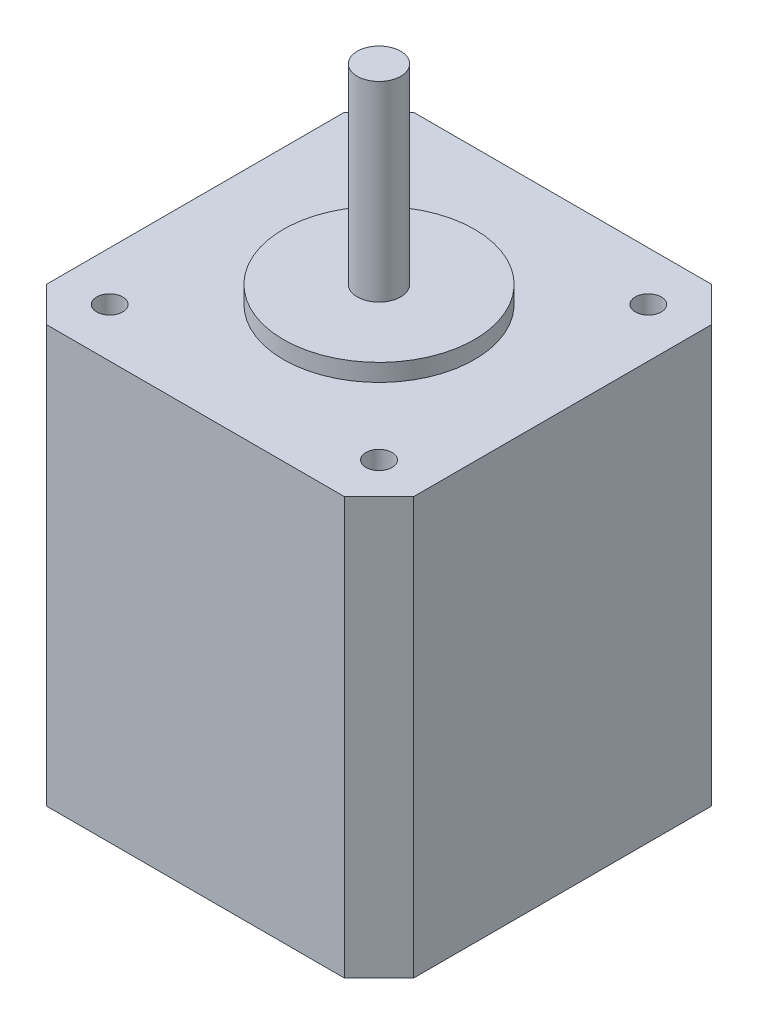
ISO-10303-21;
HEADER;
FILE_DESCRIPTION(('STEP AP214'),'2;1');
FILE_NAME('part.step','',(''),(''),'','','');
FILE_SCHEMA(('AUTOMOTIVE_DESIGN { 1 0 10303 214 1 1 1 1 }'));
ENDSEC;
DATA;
#1=APPLICATION_CONTEXT('core data for automotive mechanical design processes');
#2=APPLICATION_PROTOCOL_DEFINITION('international standard','automotive_design',2000,#1);
#3=PRODUCT_CONTEXT('',#1,'mechanical');
#4=PRODUCT('Part','Part','',(#3));
#5=PRODUCT_RELATED_PRODUCT_CATEGORY('part','',(#4));
#6=PRODUCT_DEFINITION_FORMATION('','',#4);
#7=PRODUCT_DEFINITION_CONTEXT('part definition',#1,'design');
#8=PRODUCT_DEFINITION('design','',#6,#7);
#9=PRODUCT_DEFINITION_SHAPE('','',#8);
#10=(LENGTH_UNIT() NAMED_UNIT(*) SI_UNIT(.MILLI.,.METRE.));
#11=(NAMED_UNIT(*) PLANE_ANGLE_UNIT() SI_UNIT($,.RADIAN.));
#12=(NAMED_UNIT(*) SI_UNIT($,.STERADIAN.) SOLID_ANGLE_UNIT());
#13=UNCERTAINTY_MEASURE_WITH_UNIT(LENGTH_MEASURE(1.E-05),#10,'distance_accuracy_value','');
#14=(GEOMETRIC_REPRESENTATION_CONTEXT(3) GLOBAL_UNCERTAINTY_ASSIGNED_CONTEXT((#13)) GLOBAL_UNIT_ASSIGNED_CONTEXT((#10,
#11,#12)) REPRESENTATION_CONTEXT('',''));
#15=CARTESIAN_POINT('',(0.,0.,0.));
#16=DIRECTION('',(0.,0.,1.));
#17=DIRECTION('',(1.,0.,0.));
#18=AXIS2_PLACEMENT_3D('',#15,#16,#17);
#19=CARTESIAN_POINT('',(0.,48.,0.));
#20=DIRECTION('',(0.,-1.,0.));
#21=DIRECTION('',(0.,0.,-1.));
#22=AXIS2_PLACEMENT_3D('',#19,#20,#21);
#23=PLANE('',#22);
#24=CARTESIAN_POINT('',(0.,48.,0.));
#25=DIRECTION('',(0.,1.,0.));
#26=DIRECTION('',(0.,0.,1.));
#27=AXIS2_PLACEMENT_3D('',#24,#25,#26);
#28=CIRCLE('',#27,11.);
#29=CARTESIAN_POINT('',(0.,48.,11.));
#30=VERTEX_POINT('',#29);
#31=EDGE_CURVE('E11',#30,#30,#28,.T.);
#32=ORIENTED_EDGE('',*,*,#31,.F.);
#33=EDGE_LOOP('',(#32));
#34=FACE_BOUND('',#33,.T.);
#35=CARTESIAN_POINT('',(15.5,48.,15.5));
#36=DIRECTION('',(0.,1.,0.));
#37=DIRECTION('',(0.,0.,1.));
#38=AXIS2_PLACEMENT_3D('',#35,#36,#37);
#39=CIRCLE('',#38,1.5);
#40=CARTESIAN_POINT('',(15.5,48.,17.));
#41=VERTEX_POINT('',#40);
#42=EDGE_CURVE('E382',#41,#41,#39,.T.);
#43=ORIENTED_EDGE('',*,*,#42,.F.);
#44=EDGE_LOOP('',(#43));
#45=FACE_BOUND('',#44,.T.);
#46=CARTESIAN_POINT('',(15.5,48.,-15.5));
#47=DIRECTION('',(0.,1.,0.));
#48=DIRECTION('',(0.,0.,1.));
#49=AXIS2_PLACEMENT_3D('',#46,#47,#48);
#50=CIRCLE('',#49,1.5);
#51=CARTESIAN_POINT('',(15.5,48.,-14.));
#52=VERTEX_POINT('',#51);
#53=EDGE_CURVE('E385',#52,#52,#50,.F.);
#54=ORIENTED_EDGE('',*,*,#53,.T.);
#55=EDGE_LOOP('',(#54));
#56=FACE_BOUND('',#55,.T.);
#57=DIRECTION('',(0.707106781186548,0.,0.707106781186548));
#58=VECTOR('',#57,1.);
#59=CARTESIAN_POINT('',(-19.15,48.,19.15));
#60=LINE('',#59,#58);
#61=CARTESIAN_POINT('',(-21.15,48.,17.15));
#62=VERTEX_POINT('',#61);
#63=CARTESIAN_POINT('',(-17.15,48.,21.15));
#64=VERTEX_POINT('',#63);
#65=EDGE_CURVE('E156',#62,#64,#60,.T.);
#66=ORIENTED_EDGE('',*,*,#65,.T.);
#67=DIRECTION('',(1.,0.,0.));
#68=VECTOR('',#67,1.);
#69=CARTESIAN_POINT('',(-21.15,48.,21.15));
#70=LINE('',#69,#68);
#71=CARTESIAN_POINT('',(17.15,48.,21.15));
#72=VERTEX_POINT('',#71);
#73=EDGE_CURVE('E43',#64,#72,#70,.T.);
#74=ORIENTED_EDGE('',*,*,#73,.T.);
#75=DIRECTION('',(-0.707106781186548,0.,0.707106781186547));
#76=VECTOR('',#75,1.);
#77=CARTESIAN_POINT('',(19.15,48.,19.15));
#78=LINE('',#77,#76);
#79=CARTESIAN_POINT('',(21.15,48.,17.15));
#80=VERTEX_POINT('',#79);
#81=EDGE_CURVE('E155',#80,#72,#78,.T.);
#82=ORIENTED_EDGE('',*,*,#81,.F.);
#83=DIRECTION('',(0.,0.,-1.));
#84=VECTOR('',#83,1.);
#85=CARTESIAN_POINT('',(21.15,48.,21.15));
#86=LINE('',#85,#84);
#87=CARTESIAN_POINT('',(21.15,48.,-17.15));
#88=VERTEX_POINT('',#87);
#89=EDGE_CURVE('E135',#80,#88,#86,.T.);
#90=ORIENTED_EDGE('',*,*,#89,.T.);
#91=DIRECTION('',(-0.707106781186548,0.,-0.707106781186548));
#92=VECTOR('',#91,1.);
#93=CARTESIAN_POINT('',(19.15,48.,-19.15));
#94=LINE('',#93,#92);
#95=CARTESIAN_POINT('',(17.15,48.,-21.15));
#96=VERTEX_POINT('',#95);
#97=EDGE_CURVE('E111',#88,#96,#94,.T.);
#98=ORIENTED_EDGE('',*,*,#97,.T.);
#99=DIRECTION('',(-1.,0.,0.));
#100=VECTOR('',#99,1.);
#101=CARTESIAN_POINT('',(-21.15,48.,-21.15));
#102=LINE('',#101,#100);
#103=CARTESIAN_POINT('',(-17.15,48.,-21.15));
#104=VERTEX_POINT('',#103);
#105=EDGE_CURVE('E119',#96,#104,#102,.T.);
#106=ORIENTED_EDGE('',*,*,#105,.T.);
#107=DIRECTION('',(0.707106781186548,0.,-0.707106781186548));
#108=VECTOR('',#107,1.);
#109=CARTESIAN_POINT('',(-19.15,48.,-19.15));
#110=LINE('',#109,#108);
#111=CARTESIAN_POINT('',(-21.15,48.,-17.15));
#112=VERTEX_POINT('',#111);
#113=EDGE_CURVE('E120',#112,#104,#110,.T.);
#114=ORIENTED_EDGE('',*,*,#113,.F.);
#115=DIRECTION('',(0.,0.,1.));
#116=VECTOR('',#115,1.);
#117=CARTESIAN_POINT('',(-21.15,48.,21.15));
#118=LINE('',#117,#116);
#119=EDGE_CURVE('E144',#112,#62,#118,.T.);
#120=ORIENTED_EDGE('',*,*,#119,.T.);
#121=EDGE_LOOP('',(#66,#74,#82,#90,#98,#106,#114,#120));
#122=FACE_BOUND('',#121,.T.);
#123=CARTESIAN_POINT('',(-15.5,48.,15.5));
#124=DIRECTION('',(0.,1.,0.));
#125=DIRECTION('',(0.,0.,1.));
#126=AXIS2_PLACEMENT_3D('',#123,#124,#125);
#127=CIRCLE('',#126,1.5);
#128=CARTESIAN_POINT('',(-15.5,48.,17.));
#129=VERTEX_POINT('',#128);
#130=EDGE_CURVE('E389',#129,#129,#127,.F.);
#131=ORIENTED_EDGE('',*,*,#130,.T.);
#132=EDGE_LOOP('',(#131));
#133=FACE_BOUND('',#132,.T.);
#134=CARTESIAN_POINT('',(-15.5,48.,-15.5));
#135=DIRECTION('',(0.,1.,0.));
#136=DIRECTION('',(0.,0.,1.));
#137=AXIS2_PLACEMENT_3D('',#134,#135,#136);
#138=CIRCLE('',#137,1.5);
#139=CARTESIAN_POINT('',(-15.5,48.,-14.));
#140=VERTEX_POINT('',#139);
#141=EDGE_CURVE('E395',#140,#140,#138,.T.);
#142=ORIENTED_EDGE('',*,*,#141,.F.);
#143=EDGE_LOOP('',(#142));
#144=FACE_BOUND('',#143,.T.);
#145=ADVANCED_FACE('F34',(#34,#45,#56,#122,#133,#144),#23,.F.);
#146=CARTESIAN_POINT('',(21.15,48.,21.15));
#147=DIRECTION('',(-1.,0.,0.));
#148=DIRECTION('',(0.,0.,1.));
#149=AXIS2_PLACEMENT_3D('',#146,#147,#148);
#150=PLANE('',#149);
#151=ORIENTED_EDGE('',*,*,#89,.F.);
#152=DIRECTION('',(0.,1.,0.));
#153=VECTOR('',#152,1.);
#154=CARTESIAN_POINT('',(21.15,0.,17.15));
#155=LINE('',#154,#153);
#156=CARTESIAN_POINT('',(21.15,0.,17.15));
#157=VERTEX_POINT('',#156);
#158=EDGE_CURVE('E162',#157,#80,#155,.T.);
#159=ORIENTED_EDGE('',*,*,#158,.F.);
#160=DIRECTION('',(0.,0.,-1.));
#161=VECTOR('',#160,1.);
#162=CARTESIAN_POINT('',(21.15,0.,21.15));
#163=LINE('',#162,#161);
#164=CARTESIAN_POINT('',(21.15,0.,-17.15));
#165=VERTEX_POINT('',#164);
#166=EDGE_CURVE('E127',#157,#165,#163,.T.);
#167=ORIENTED_EDGE('',*,*,#166,.T.);
#168=DIRECTION('',(0.,1.,0.));
#169=VECTOR('',#168,1.);
#170=CARTESIAN_POINT('',(21.15,0.,-17.15));
#171=LINE('',#170,#169);
#172=EDGE_CURVE('E106',#165,#88,#171,.T.);
#173=ORIENTED_EDGE('',*,*,#172,.T.);
#174=EDGE_LOOP('',(#151,#159,#167,#173));
#175=FACE_BOUND('',#174,.T.);
#176=ADVANCED_FACE('F36',(#175),#150,.F.);
#177=CARTESIAN_POINT('',(-21.15,48.,-21.15));
#178=DIRECTION('',(0.,0.,1.));
#179=DIRECTION('',(1.,0.,0.));
#180=AXIS2_PLACEMENT_3D('',#177,#178,#179);
#181=PLANE('',#180);
#182=DIRECTION('',(0.,1.,0.));
#183=VECTOR('',#182,1.);
#184=CARTESIAN_POINT('',(17.15,0.,-21.15));
#185=LINE('',#184,#183);
#186=CARTESIAN_POINT('',(17.15,0.,-21.15));
#187=VERTEX_POINT('',#186);
#188=EDGE_CURVE('E103',#187,#96,#185,.T.);
#189=ORIENTED_EDGE('',*,*,#188,.F.);
#190=DIRECTION('',(-1.,0.,0.));
#191=VECTOR('',#190,1.);
#192=CARTESIAN_POINT('',(-21.15,0.,-21.15));
#193=LINE('',#192,#191);
#194=CARTESIAN_POINT('',(-17.15,0.,-21.15));
#195=VERTEX_POINT('',#194);
#196=EDGE_CURVE('E117',#187,#195,#193,.T.);
#197=ORIENTED_EDGE('',*,*,#196,.T.);
#198=DIRECTION('',(0.,1.,0.));
#199=VECTOR('',#198,1.);
#200=CARTESIAN_POINT('',(-17.15,0.,-21.15));
#201=LINE('',#200,#199);
#202=EDGE_CURVE('E51',#195,#104,#201,.T.);
#203=ORIENTED_EDGE('',*,*,#202,.T.);
#204=ORIENTED_EDGE('',*,*,#105,.F.);
#205=EDGE_LOOP('',(#189,#197,#203,#204));
#206=FACE_BOUND('',#205,.T.);
#207=ADVANCED_FACE('F116',(#206),#181,.F.);
#208=CARTESIAN_POINT('',(-21.15,48.,21.15));
#209=DIRECTION('',(1.,0.,0.));
#210=DIRECTION('',(0.,0.,-1.));
#211=AXIS2_PLACEMENT_3D('',#208,#209,#210);
#212=PLANE('',#211);
#213=DIRECTION('',(0.,1.,0.));
#214=VECTOR('',#213,1.);
#215=CARTESIAN_POINT('',(-21.15,0.,17.15));
#216=LINE('',#215,#214);
#217=CARTESIAN_POINT('',(-21.15,0.,17.15));
#218=VERTEX_POINT('',#217);
#219=EDGE_CURVE('E59',#218,#62,#216,.T.);
#220=ORIENTED_EDGE('',*,*,#219,.T.);
#221=ORIENTED_EDGE('',*,*,#119,.F.);
#222=DIRECTION('',(0.,1.,0.));
#223=VECTOR('',#222,1.);
#224=CARTESIAN_POINT('',(-21.15,0.,-17.15));
#225=LINE('',#224,#223);
#226=CARTESIAN_POINT('',(-21.15,0.,-17.15));
#227=VERTEX_POINT('',#226);
#228=EDGE_CURVE('E147',#227,#112,#225,.T.);
#229=ORIENTED_EDGE('',*,*,#228,.F.);
#230=DIRECTION('',(0.,0.,1.));
#231=VECTOR('',#230,1.);
#232=CARTESIAN_POINT('',(-21.15,0.,21.15));
#233=LINE('',#232,#231);
#234=EDGE_CURVE('E126',#227,#218,#233,.T.);
#235=ORIENTED_EDGE('',*,*,#234,.T.);
#236=EDGE_LOOP('',(#220,#221,#229,#235));
#237=FACE_BOUND('',#236,.T.);
#238=ADVANCED_FACE('F182',(#237),#212,.F.);
#239=CARTESIAN_POINT('',(-21.15,48.,21.15));
#240=DIRECTION('',(0.,0.,-1.));
#241=DIRECTION('',(-1.,0.,0.));
#242=AXIS2_PLACEMENT_3D('',#239,#240,#241);
#243=PLANE('',#242);
#244=DIRECTION('',(0.,1.,0.));
#245=VECTOR('',#244,1.);
#246=CARTESIAN_POINT('',(-17.15,0.,21.15));
#247=LINE('',#246,#245);
#248=CARTESIAN_POINT('',(-17.15,0.,21.15));
#249=VERTEX_POINT('',#248);
#250=EDGE_CURVE('E158',#249,#64,#247,.T.);
#251=ORIENTED_EDGE('',*,*,#250,.F.);
#252=DIRECTION('',(1.,0.,0.));
#253=VECTOR('',#252,1.);
#254=CARTESIAN_POINT('',(-21.15,0.,21.15));
#255=LINE('',#254,#253);
#256=CARTESIAN_POINT('',(17.15,0.,21.15));
#257=VERTEX_POINT('',#256);
#258=EDGE_CURVE('E130',#249,#257,#255,.T.);
#259=ORIENTED_EDGE('',*,*,#258,.T.);
#260=DIRECTION('',(0.,1.,0.));
#261=VECTOR('',#260,1.);
#262=CARTESIAN_POINT('',(17.15,0.,21.15));
#263=LINE('',#262,#261);
#264=EDGE_CURVE('E159',#257,#72,#263,.T.);
#265=ORIENTED_EDGE('',*,*,#264,.T.);
#266=ORIENTED_EDGE('',*,*,#73,.F.);
#267=EDGE_LOOP('',(#251,#259,#265,#266));
#268=FACE_BOUND('',#267,.T.);
#269=ADVANCED_FACE('F157',(#268),#243,.F.);
#270=CARTESIAN_POINT('',(0.,0.,0.));
#271=DIRECTION('',(0.,-1.,0.));
#272=DIRECTION('',(0.,0.,-1.));
#273=AXIS2_PLACEMENT_3D('',#270,#271,#272);
#274=PLANE('',#273);
#275=ORIENTED_EDGE('',*,*,#258,.F.);
#276=DIRECTION('',(0.707106781186548,0.,0.707106781186548));
#277=VECTOR('',#276,1.);
#278=CARTESIAN_POINT('',(-19.15,0.,19.15));
#279=LINE('',#278,#277);
#280=EDGE_CURVE('E170',#218,#249,#279,.T.);
#281=ORIENTED_EDGE('',*,*,#280,.F.);
#282=ORIENTED_EDGE('',*,*,#234,.F.);
#283=DIRECTION('',(0.707106781186548,0.,-0.707106781186548));
#284=VECTOR('',#283,1.);
#285=CARTESIAN_POINT('',(-19.15,0.,-19.15));
#286=LINE('',#285,#284);
#287=EDGE_CURVE('E125',#227,#195,#286,.T.);
#288=ORIENTED_EDGE('',*,*,#287,.T.);
#289=ORIENTED_EDGE('',*,*,#196,.F.);
#290=DIRECTION('',(-0.707106781186548,0.,-0.707106781186548));
#291=VECTOR('',#290,1.);
#292=CARTESIAN_POINT('',(19.15,0.,-19.15));
#293=LINE('',#292,#291);
#294=EDGE_CURVE('E100',#165,#187,#293,.T.);
#295=ORIENTED_EDGE('',*,*,#294,.F.);
#296=ORIENTED_EDGE('',*,*,#166,.F.);
#297=DIRECTION('',(-0.707106781186548,0.,0.707106781186547));
#298=VECTOR('',#297,1.);
#299=CARTESIAN_POINT('',(19.15,0.,19.15));
#300=LINE('',#299,#298);
#301=EDGE_CURVE('E165',#157,#257,#300,.T.);
#302=ORIENTED_EDGE('',*,*,#301,.T.);
#303=EDGE_LOOP('',(#275,#281,#282,#288,#289,#295,#296,#302));
#304=FACE_BOUND('',#303,.T.);
#305=ADVANCED_FACE('F123',(#304),#274,.T.);
#306=CARTESIAN_POINT('',(-19.15,0.,-19.15));
#307=DIRECTION('',(0.707106781186547,0.,0.707106781186547));
#308=DIRECTION('',(0.707106781186548,0.,-0.707106781186548));
#309=AXIS2_PLACEMENT_3D('',#306,#307,#308);
#310=PLANE('',#309);
#311=ORIENTED_EDGE('',*,*,#113,.T.);
#312=ORIENTED_EDGE('',*,*,#202,.F.);
#313=ORIENTED_EDGE('',*,*,#287,.F.);
#314=ORIENTED_EDGE('',*,*,#228,.T.);
#315=EDGE_LOOP('',(#311,#312,#313,#314));
#316=FACE_BOUND('',#315,.T.);
#317=ADVANCED_FACE('F179',(#316),#310,.F.);
#318=CARTESIAN_POINT('',(19.15,0.,-19.15));
#319=DIRECTION('',(0.707106781186547,0.,-0.707106781186547));
#320=DIRECTION('',(-0.707106781186548,0.,-0.707106781186548));
#321=AXIS2_PLACEMENT_3D('',#318,#319,#320);
#322=PLANE('',#321);
#323=ORIENTED_EDGE('',*,*,#97,.F.);
#324=ORIENTED_EDGE('',*,*,#172,.F.);
#325=ORIENTED_EDGE('',*,*,#294,.T.);
#326=ORIENTED_EDGE('',*,*,#188,.T.);
#327=EDGE_LOOP('',(#323,#324,#325,#326));
#328=FACE_BOUND('',#327,.T.);
#329=ADVANCED_FACE('F102',(#328),#322,.T.);
#330=CARTESIAN_POINT('',(19.15,0.,19.15));
#331=DIRECTION('',(-0.707106781186547,0.,-0.707106781186548));
#332=DIRECTION('',(-0.707106781186548,0.,0.707106781186547));
#333=AXIS2_PLACEMENT_3D('',#330,#331,#332);
#334=PLANE('',#333);
#335=ORIENTED_EDGE('',*,*,#81,.T.);
#336=ORIENTED_EDGE('',*,*,#264,.F.);
#337=ORIENTED_EDGE('',*,*,#301,.F.);
#338=ORIENTED_EDGE('',*,*,#158,.T.);
#339=EDGE_LOOP('',(#335,#336,#337,#338));
#340=FACE_BOUND('',#339,.T.);
#341=ADVANCED_FACE('F186',(#340),#334,.F.);
#342=CARTESIAN_POINT('',(-19.15,0.,19.15));
#343=DIRECTION('',(-0.707106781186547,0.,0.707106781186547));
#344=DIRECTION('',(0.707106781186548,0.,0.707106781186548));
#345=AXIS2_PLACEMENT_3D('',#342,#343,#344);
#346=PLANE('',#345);
#347=ORIENTED_EDGE('',*,*,#65,.F.);
#348=ORIENTED_EDGE('',*,*,#219,.F.);
#349=ORIENTED_EDGE('',*,*,#280,.T.);
#350=ORIENTED_EDGE('',*,*,#250,.T.);
#351=EDGE_LOOP('',(#347,#348,#349,#350));
#352=FACE_BOUND('',#351,.T.);
#353=ADVANCED_FACE('F183',(#352),#346,.T.);
#354=CARTESIAN_POINT('',(15.5,43.5,-15.5));
#355=DIRECTION('',(0.,1.,0.));
#356=DIRECTION('',(0.,0.,1.));
#357=AXIS2_PLACEMENT_3D('',#354,#355,#356);
#358=CYLINDRICAL_SURFACE('',#357,1.5);
#359=CARTESIAN_POINT('',(15.5,43.5,-15.5));
#360=DIRECTION('',(0.,1.,0.));
#361=DIRECTION('',(0.,0.,1.));
#362=AXIS2_PLACEMENT_3D('',#359,#360,#361);
#363=CIRCLE('',#362,1.5);
#364=CARTESIAN_POINT('',(15.5,43.5,-14.));
#365=VERTEX_POINT('',#364);
#366=EDGE_CURVE('E173',#365,#365,#363,.F.);
#367=ORIENTED_EDGE('',*,*,#366,.T.);
#368=EDGE_LOOP('',(#367));
#369=FACE_BOUND('',#368,.T.);
#370=ORIENTED_EDGE('',*,*,#53,.F.);
#371=EDGE_LOOP('',(#370));
#372=FACE_BOUND('',#371,.T.);
#373=ADVANCED_FACE('F185',(#369,#372),#358,.F.);
#374=CARTESIAN_POINT('',(0.,43.5,0.));
#375=DIRECTION('',(0.,1.,0.));
#376=DIRECTION('',(0.,0.,1.));
#377=AXIS2_PLACEMENT_3D('',#374,#375,#376);
#378=PLANE('',#377);
#379=ORIENTED_EDGE('',*,*,#366,.F.);
#380=EDGE_LOOP('',(#379));
#381=FACE_BOUND('',#380,.T.);
#382=ADVANCED_FACE('F192',(#381),#378,.T.);
#383=CARTESIAN_POINT('',(15.5,43.5,15.5));
#384=DIRECTION('',(0.,1.,0.));
#385=DIRECTION('',(0.,0.,1.));
#386=AXIS2_PLACEMENT_3D('',#383,#384,#385);
#387=CYLINDRICAL_SURFACE('',#386,1.5);
#388=CARTESIAN_POINT('',(15.5,43.5,15.5));
#389=DIRECTION('',(0.,1.,0.));
#390=DIRECTION('',(0.,0.,1.));
#391=AXIS2_PLACEMENT_3D('',#388,#389,#390);
#392=CIRCLE('',#391,1.5);
#393=CARTESIAN_POINT('',(15.5,43.5,17.));
#394=VERTEX_POINT('',#393);
#395=EDGE_CURVE('E386',#394,#394,#392,.T.);
#396=ORIENTED_EDGE('',*,*,#395,.F.);
#397=EDGE_LOOP('',(#396));
#398=FACE_BOUND('',#397,.T.);
#399=ORIENTED_EDGE('',*,*,#42,.T.);
#400=EDGE_LOOP('',(#399));
#401=FACE_BOUND('',#400,.T.);
#402=ADVANCED_FACE('F264',(#398,#401),#387,.F.);
#403=CARTESIAN_POINT('',(0.,43.5,0.));
#404=DIRECTION('',(0.,1.,0.));
#405=DIRECTION('',(0.,0.,1.));
#406=AXIS2_PLACEMENT_3D('',#403,#404,#405);
#407=PLANE('',#406);
#408=ORIENTED_EDGE('',*,*,#395,.T.);
#409=EDGE_LOOP('',(#408));
#410=FACE_BOUND('',#409,.T.);
#411=ADVANCED_FACE('F274',(#410),#407,.T.);
#412=CARTESIAN_POINT('',(-15.5,43.5,15.5));
#413=DIRECTION('',(0.,1.,0.));
#414=DIRECTION('',(0.,0.,1.));
#415=AXIS2_PLACEMENT_3D('',#412,#413,#414);
#416=CYLINDRICAL_SURFACE('',#415,1.5);
#417=CARTESIAN_POINT('',(-15.5,43.5,15.5));
#418=DIRECTION('',(0.,1.,0.));
#419=DIRECTION('',(0.,0.,1.));
#420=AXIS2_PLACEMENT_3D('',#417,#418,#419);
#421=CIRCLE('',#420,1.5);
#422=CARTESIAN_POINT('',(-15.5,43.5,17.));
#423=VERTEX_POINT('',#422);
#424=EDGE_CURVE('E392',#423,#423,#421,.F.);
#425=ORIENTED_EDGE('',*,*,#424,.T.);
#426=EDGE_LOOP('',(#425));
#427=FACE_BOUND('',#426,.T.);
#428=ORIENTED_EDGE('',*,*,#130,.F.);
#429=EDGE_LOOP('',(#428));
#430=FACE_BOUND('',#429,.T.);
#431=ADVANCED_FACE('F284',(#427,#430),#416,.F.);
#432=CARTESIAN_POINT('',(0.,43.5,0.));
#433=DIRECTION('',(0.,1.,0.));
#434=DIRECTION('',(0.,0.,1.));
#435=AXIS2_PLACEMENT_3D('',#432,#433,#434);
#436=PLANE('',#435);
#437=ORIENTED_EDGE('',*,*,#424,.F.);
#438=EDGE_LOOP('',(#437));
#439=FACE_BOUND('',#438,.T.);
#440=ADVANCED_FACE('F294',(#439),#436,.T.);
#441=CARTESIAN_POINT('',(-15.5,43.5,-15.5));
#442=DIRECTION('',(0.,1.,0.));
#443=DIRECTION('',(0.,0.,1.));
#444=AXIS2_PLACEMENT_3D('',#441,#442,#443);
#445=CYLINDRICAL_SURFACE('',#444,1.5);
#446=CARTESIAN_POINT('',(-15.5,43.5,-15.5));
#447=DIRECTION('',(0.,1.,0.));
#448=DIRECTION('',(0.,0.,1.));
#449=AXIS2_PLACEMENT_3D('',#446,#447,#448);
#450=CIRCLE('',#449,1.5);
#451=CARTESIAN_POINT('',(-15.5,43.5,-14.));
#452=VERTEX_POINT('',#451);
#453=EDGE_CURVE('E380',#452,#452,#450,.T.);
#454=ORIENTED_EDGE('',*,*,#453,.F.);
#455=EDGE_LOOP('',(#454));
#456=FACE_BOUND('',#455,.T.);
#457=ORIENTED_EDGE('',*,*,#141,.T.);
#458=EDGE_LOOP('',(#457));
#459=FACE_BOUND('',#458,.T.);
#460=ADVANCED_FACE('F304',(#456,#459),#445,.F.);
#461=CARTESIAN_POINT('',(-15.5,43.5,-15.5));
#462=DIRECTION('',(0.,1.,0.));
#463=DIRECTION('',(0.,0.,1.));
#464=AXIS2_PLACEMENT_3D('',#461,#462,#463);
#465=PLANE('',#464);
#466=ORIENTED_EDGE('',*,*,#453,.T.);
#467=EDGE_LOOP('',(#466));
#468=FACE_BOUND('',#467,.T.);
#469=ADVANCED_FACE('F314',(#468),#465,.T.);
#470=CARTESIAN_POINT('',(0.,50.,0.));
#471=DIRECTION('',(0.,-1.,0.));
#472=DIRECTION('',(0.,0.,-1.));
#473=AXIS2_PLACEMENT_3D('',#470,#471,#472);
#474=CYLINDRICAL_SURFACE('',#473,11.);
#475=CARTESIAN_POINT('',(0.,50.,0.));
#476=DIRECTION('',(0.,1.,0.));
#477=DIRECTION('',(0.,0.,1.));
#478=AXIS2_PLACEMENT_3D('',#475,#476,#477);
#479=CIRCLE('',#478,11.);
#480=CARTESIAN_POINT('',(0.,50.,11.));
#481=VERTEX_POINT('',#480);
#482=EDGE_CURVE('E377',#481,#481,#479,.T.);
#483=ORIENTED_EDGE('',*,*,#482,.F.);
#484=EDGE_LOOP('',(#483));
#485=FACE_BOUND('',#484,.T.);
#486=ORIENTED_EDGE('',*,*,#31,.T.);
#487=EDGE_LOOP('',(#486));
#488=FACE_BOUND('',#487,.T.);
#489=ADVANCED_FACE('F323',(#485,#488),#474,.T.);
#490=CARTESIAN_POINT('',(0.,50.,0.));
#491=DIRECTION('',(0.,1.,0.));
#492=DIRECTION('',(0.,0.,1.));
#493=AXIS2_PLACEMENT_3D('',#490,#491,#492);
#494=PLANE('',#493);
#495=CARTESIAN_POINT('',(0.,50.,0.));
#496=DIRECTION('',(0.,1.,0.));
#497=DIRECTION('',(0.,0.,1.));
#498=AXIS2_PLACEMENT_3D('',#495,#496,#497);
#499=CIRCLE('',#498,2.5);
#500=CARTESIAN_POINT('',(0.,50.,2.5));
#501=VERTEX_POINT('',#500);
#502=EDGE_CURVE('E38',#501,#501,#499,.F.);
#503=ORIENTED_EDGE('',*,*,#502,.T.);
#504=EDGE_LOOP('',(#503));
#505=FACE_BOUND('',#504,.T.);
#506=ORIENTED_EDGE('',*,*,#482,.T.);
#507=EDGE_LOOP('',(#506));
#508=FACE_BOUND('',#507,.T.);
#509=ADVANCED_FACE('F337',(#505,#508),#494,.T.);
#510=CARTESIAN_POINT('',(0.,72.,0.));
#511=DIRECTION('',(0.,-1.,0.));
#512=DIRECTION('',(0.,0.,-1.));
#513=AXIS2_PLACEMENT_3D('',#510,#511,#512);
#514=CYLINDRICAL_SURFACE('',#513,2.5);
#515=ORIENTED_EDGE('',*,*,#502,.F.);
#516=EDGE_LOOP('',(#515));
#517=FACE_BOUND('',#516,.T.);
#518=CARTESIAN_POINT('',(0.,72.,0.));
#519=DIRECTION('',(0.,1.,0.));
#520=DIRECTION('',(0.,0.,1.));
#521=AXIS2_PLACEMENT_3D('',#518,#519,#520);
#522=CIRCLE('',#521,2.5);
#523=CARTESIAN_POINT('',(0.,72.,2.5));
#524=VERTEX_POINT('',#523);
#525=EDGE_CURVE('E373',#524,#524,#522,.T.);
#526=ORIENTED_EDGE('',*,*,#525,.F.);
#527=EDGE_LOOP('',(#526));
#528=FACE_BOUND('',#527,.T.);
#529=ADVANCED_FACE('F347',(#517,#528),#514,.T.);
#530=CARTESIAN_POINT('',(0.,72.,0.));
#531=DIRECTION('',(0.,1.,0.));
#532=DIRECTION('',(0.,0.,1.));
#533=AXIS2_PLACEMENT_3D('',#530,#531,#532);
#534=PLANE('',#533);
#535=ORIENTED_EDGE('',*,*,#525,.T.);
#536=EDGE_LOOP('',(#535));
#537=FACE_BOUND('',#536,.T.);
#538=ADVANCED_FACE('F357',(#537),#534,.T.);
#539=CLOSED_SHELL('',(#145,#176,#207,#238,#269,#305,#317,#329,#341,#353,#373,#382,#402,#411,
#431,#440,#460,#469,#489,#509,#529,#538));
#540=MANIFOLD_SOLID_BREP('B2',#539);
#541=ADVANCED_BREP_SHAPE_REPRESENTATION('',(#18,#540),#14);
#542=SHAPE_DEFINITION_REPRESENTATION(#9,#541);
ENDSEC;
END-ISO-10303-21;
